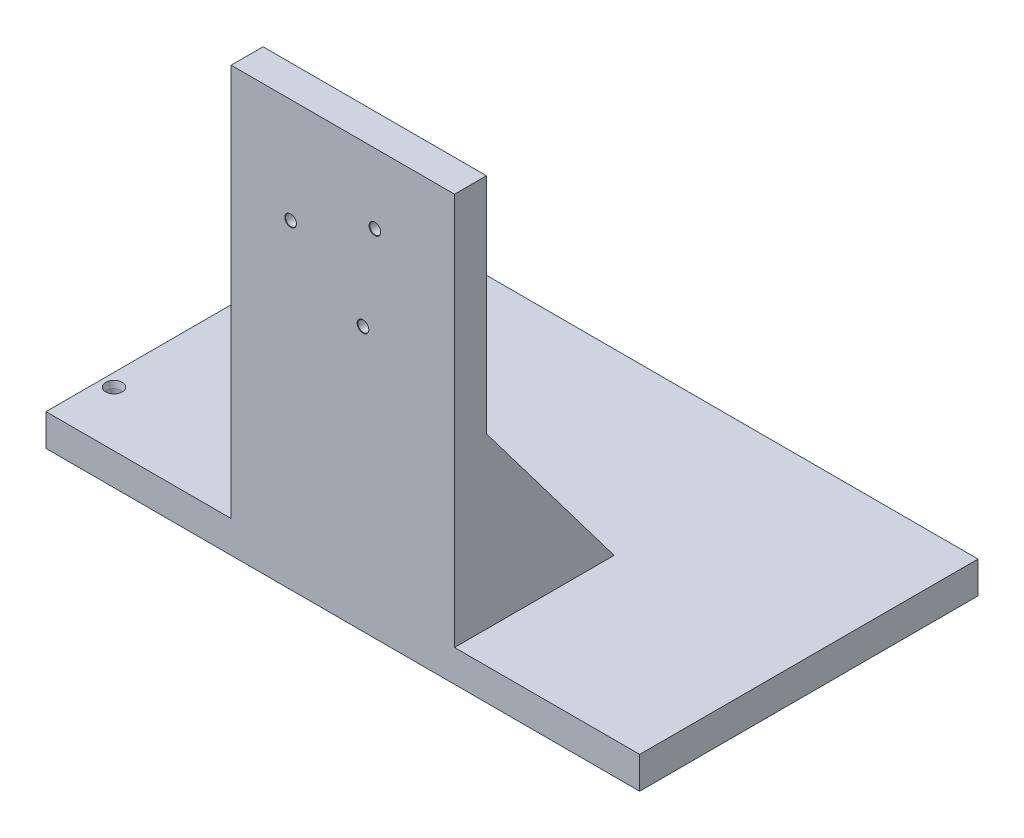
ISO-10303-21;
HEADER;
FILE_DESCRIPTION(('STEP AP214'),'2;1');
FILE_NAME('part.step','',(''),(''),'','','');
FILE_SCHEMA(('AUTOMOTIVE_DESIGN { 1 0 10303 214 1 1 1 1 }'));
ENDSEC;
DATA;
#1=APPLICATION_CONTEXT('core data for automotive mechanical design processes');
#2=APPLICATION_PROTOCOL_DEFINITION('international standard','automotive_design',2000,#1);
#3=PRODUCT_CONTEXT('',#1,'mechanical');
#4=PRODUCT('Part','Part','',(#3));
#5=PRODUCT_RELATED_PRODUCT_CATEGORY('part','',(#4));
#6=PRODUCT_DEFINITION_FORMATION('','',#4);
#7=PRODUCT_DEFINITION_CONTEXT('part definition',#1,'design');
#8=PRODUCT_DEFINITION('design','',#6,#7);
#9=PRODUCT_DEFINITION_SHAPE('','',#8);
#10=(LENGTH_UNIT() NAMED_UNIT(*) SI_UNIT(.MILLI.,.METRE.));
#11=(NAMED_UNIT(*) PLANE_ANGLE_UNIT() SI_UNIT($,.RADIAN.));
#12=(NAMED_UNIT(*) SI_UNIT($,.STERADIAN.) SOLID_ANGLE_UNIT());
#13=UNCERTAINTY_MEASURE_WITH_UNIT(LENGTH_MEASURE(1.E-05),#10,'distance_accuracy_value','');
#14=(GEOMETRIC_REPRESENTATION_CONTEXT(3) GLOBAL_UNCERTAINTY_ASSIGNED_CONTEXT((#13)) GLOBAL_UNIT_ASSIGNED_CONTEXT((#10,
#11,#12)) REPRESENTATION_CONTEXT('',''));
#15=CARTESIAN_POINT('',(0.,0.,0.));
#16=DIRECTION('',(0.,0.,1.));
#17=DIRECTION('',(1.,0.,0.));
#18=AXIS2_PLACEMENT_3D('',#15,#16,#17);
#19=CARTESIAN_POINT('',(35.,-35.,10.));
#20=DIRECTION('',(-1.,0.,0.));
#21=DIRECTION('',(0.,0.,1.));
#22=AXIS2_PLACEMENT_3D('',#19,#20,#21);
#23=PLANE('',#22);
#24=DIRECTION('',(0.,0.,1.));
#25=VECTOR('',#24,1.);
#26=CARTESIAN_POINT('',(35.,-88.,10.));
#27=LINE('',#26,#25);
#28=CARTESIAN_POINT('',(35.,-88.,-39.9999999999999));
#29=VERTEX_POINT('',#28);
#30=CARTESIAN_POINT('',(35.,-88.,10.));
#31=VERTEX_POINT('',#30);
#32=EDGE_CURVE('E64',#29,#31,#27,.T.);
#33=ORIENTED_EDGE('',*,*,#32,.F.);
#34=DIRECTION('',(0.,0.79818915033323,0.602406905911873));
#35=VECTOR('',#34,1.);
#36=CARTESIAN_POINT('',(35.,-30.1916534361534,3.62894080290327));
#37=LINE('',#36,#35);
#38=CARTESIAN_POINT('',(35.,-35.0000000000002,0.));
#39=VERTEX_POINT('',#38);
#40=EDGE_CURVE('E11',#29,#39,#37,.T.);
#41=ORIENTED_EDGE('',*,*,#40,.T.);
#42=DIRECTION('',(0.,1.,0.));
#43=VECTOR('',#42,1.);
#44=CARTESIAN_POINT('',(35.,-35.,0.));
#45=LINE('',#44,#43);
#46=CARTESIAN_POINT('',(35.,35.,0.));
#47=VERTEX_POINT('',#46);
#48=EDGE_CURVE('E186',#39,#47,#45,.T.);
#49=ORIENTED_EDGE('',*,*,#48,.T.);
#50=DIRECTION('',(0.,0.,-1.));
#51=VECTOR('',#50,1.);
#52=CARTESIAN_POINT('',(35.,35.,10.));
#53=LINE('',#52,#51);
#54=CARTESIAN_POINT('',(35.,35.,10.));
#55=VERTEX_POINT('',#54);
#56=EDGE_CURVE('E203',#55,#47,#53,.T.);
#57=ORIENTED_EDGE('',*,*,#56,.F.);
#58=DIRECTION('',(0.,1.,0.));
#59=VECTOR('',#58,1.);
#60=CARTESIAN_POINT('',(35.,-35.,10.));
#61=LINE('',#60,#59);
#62=EDGE_CURVE('E187',#31,#55,#61,.T.);
#63=ORIENTED_EDGE('',*,*,#62,.F.);
#64=EDGE_LOOP('',(#33,#41,#49,#57,#63));
#65=FACE_BOUND('',#64,.T.);
#66=ADVANCED_FACE('F41',(#65),#23,.F.);
#67=CARTESIAN_POINT('',(-35.,-35.,10.));
#68=DIRECTION('',(1.,0.,0.));
#69=DIRECTION('',(0.,0.,-1.));
#70=AXIS2_PLACEMENT_3D('',#67,#68,#69);
#71=PLANE('',#70);
#72=DIRECTION('',(0.,0.,-1.));
#73=VECTOR('',#72,1.);
#74=CARTESIAN_POINT('',(-35.,-88.,10.));
#75=LINE('',#74,#73);
#76=CARTESIAN_POINT('',(-35.,-88.,10.));
#77=VERTEX_POINT('',#76);
#78=CARTESIAN_POINT('',(-35.,-88.,-39.9999999999999));
#79=VERTEX_POINT('',#78);
#80=EDGE_CURVE('E57',#77,#79,#75,.T.);
#81=ORIENTED_EDGE('',*,*,#80,.F.);
#82=DIRECTION('',(0.,-1.,0.));
#83=VECTOR('',#82,1.);
#84=CARTESIAN_POINT('',(-35.,-35.,10.));
#85=LINE('',#84,#83);
#86=CARTESIAN_POINT('',(-35.,35.,10.));
#87=VERTEX_POINT('',#86);
#88=EDGE_CURVE('E192',#87,#77,#85,.T.);
#89=ORIENTED_EDGE('',*,*,#88,.F.);
#90=DIRECTION('',(0.,0.,-1.));
#91=VECTOR('',#90,1.);
#92=CARTESIAN_POINT('',(-35.,35.,10.));
#93=LINE('',#92,#91);
#94=CARTESIAN_POINT('',(-35.,35.,0.));
#95=VERTEX_POINT('',#94);
#96=EDGE_CURVE('E195',#87,#95,#93,.T.);
#97=ORIENTED_EDGE('',*,*,#96,.T.);
#98=DIRECTION('',(0.,-1.,0.));
#99=VECTOR('',#98,1.);
#100=CARTESIAN_POINT('',(-35.,-35.,0.));
#101=LINE('',#100,#99);
#102=CARTESIAN_POINT('',(-35.,-35.0000000000002,0.));
#103=VERTEX_POINT('',#102);
#104=EDGE_CURVE('E190',#95,#103,#101,.T.);
#105=ORIENTED_EDGE('',*,*,#104,.T.);
#106=DIRECTION('',(0.,-0.79818915033323,-0.602406905911873));
#107=VECTOR('',#106,1.);
#108=CARTESIAN_POINT('',(-35.,-30.1916534361534,3.62894080290327));
#109=LINE('',#108,#107);
#110=EDGE_CURVE('E50',#103,#79,#109,.T.);
#111=ORIENTED_EDGE('',*,*,#110,.T.);
#112=EDGE_LOOP('',(#81,#89,#97,#105,#111));
#113=FACE_BOUND('',#112,.T.);
#114=ADVANCED_FACE('F212',(#113),#71,.F.);
#115=CARTESIAN_POINT('',(0.,0.,0.));
#116=DIRECTION('',(0.,0.,-1.));
#117=DIRECTION('',(-1.,0.,0.));
#118=AXIS2_PLACEMENT_3D('',#115,#116,#117);
#119=PLANE('',#118);
#120=CARTESIAN_POINT('',(6.31427663402399,-15.2440122864362,0.));
#121=DIRECTION('',(0.,0.,-1.));
#122=DIRECTION('',(-1.,0.,0.));
#123=AXIS2_PLACEMENT_3D('',#120,#121,#122);
#124=CIRCLE('',#123,1.7);
#125=CARTESIAN_POINT('',(4.61427663402399,-15.2440122864362,0.));
#126=VERTEX_POINT('',#125);
#127=EDGE_CURVE('E165',#126,#126,#124,.T.);
#128=ORIENTED_EDGE('',*,*,#127,.F.);
#129=EDGE_LOOP('',(#128));
#130=FACE_BOUND('',#129,.T.);
#131=CARTESIAN_POINT('',(10.0445635786439,13.0903301148054,0.));
#132=DIRECTION('',(0.,0.,-1.));
#133=DIRECTION('',(-1.,0.,0.));
#134=AXIS2_PLACEMENT_3D('',#131,#132,#133);
#135=CIRCLE('',#134,1.7);
#136=CARTESIAN_POINT('',(8.34456357864391,13.0903301148054,0.));
#137=VERTEX_POINT('',#136);
#138=EDGE_CURVE('E174',#137,#137,#135,.T.);
#139=ORIENTED_EDGE('',*,*,#138,.F.);
#140=EDGE_LOOP('',(#139));
#141=FACE_BOUND('',#140,.T.);
#142=CARTESIAN_POINT('',(-16.3588402126679,2.1536821716308,0.));
#143=DIRECTION('',(0.,0.,-1.));
#144=DIRECTION('',(-1.,0.,0.));
#145=AXIS2_PLACEMENT_3D('',#142,#143,#144);
#146=CIRCLE('',#145,1.7);
#147=CARTESIAN_POINT('',(-18.0588402126679,2.1536821716308,0.));
#148=VERTEX_POINT('',#147);
#149=EDGE_CURVE('E183',#148,#148,#146,.T.);
#150=ORIENTED_EDGE('',*,*,#149,.F.);
#151=EDGE_LOOP('',(#150));
#152=FACE_BOUND('',#151,.T.);
#153=ORIENTED_EDGE('',*,*,#48,.F.);
#154=DIRECTION('',(-1.,0.,0.));
#155=VECTOR('',#154,1.);
#156=CARTESIAN_POINT('',(0.,-35.0000000000002,0.));
#157=LINE('',#156,#155);
#158=EDGE_CURVE('E206',#39,#103,#157,.T.);
#159=ORIENTED_EDGE('',*,*,#158,.T.);
#160=ORIENTED_EDGE('',*,*,#104,.F.);
#161=DIRECTION('',(-1.,0.,0.));
#162=VECTOR('',#161,1.);
#163=CARTESIAN_POINT('',(-35.,35.,0.));
#164=LINE('',#163,#162);
#165=EDGE_CURVE('E197',#47,#95,#164,.T.);
#166=ORIENTED_EDGE('',*,*,#165,.F.);
#167=EDGE_LOOP('',(#153,#159,#160,#166));
#168=FACE_BOUND('',#167,.T.);
#169=ADVANCED_FACE('F232',(#130,#141,#152,#168),#119,.T.);
#170=CARTESIAN_POINT('',(0.,0.,10.));
#171=DIRECTION('',(0.,0.,-1.));
#172=DIRECTION('',(-1.,0.,0.));
#173=AXIS2_PLACEMENT_3D('',#170,#171,#172);
#174=PLANE('',#173);
#175=DIRECTION('',(-1.,0.,0.));
#176=VECTOR('',#175,1.);
#177=CARTESIAN_POINT('',(-35.,-98.,10.));
#178=LINE('',#177,#176);
#179=CARTESIAN_POINT('',(93.,-98.,10.));
#180=VERTEX_POINT('',#179);
#181=CARTESIAN_POINT('',(-93.,-98.,10.));
#182=VERTEX_POINT('',#181);
#183=EDGE_CURVE('E157',#180,#182,#178,.T.);
#184=ORIENTED_EDGE('',*,*,#183,.F.);
#185=DIRECTION('',(0.,-1.,0.));
#186=VECTOR('',#185,1.);
#187=CARTESIAN_POINT('',(93.,-88.,10.));
#188=LINE('',#187,#186);
#189=CARTESIAN_POINT('',(93.,-88.,10.));
#190=VERTEX_POINT('',#189);
#191=EDGE_CURVE('E151',#190,#180,#188,.T.);
#192=ORIENTED_EDGE('',*,*,#191,.F.);
#193=DIRECTION('',(1.,0.,0.));
#194=VECTOR('',#193,1.);
#195=CARTESIAN_POINT('',(-93.,-88.,10.));
#196=LINE('',#195,#194);
#197=EDGE_CURVE('E145',#31,#190,#196,.T.);
#198=ORIENTED_EDGE('',*,*,#197,.F.);
#199=ORIENTED_EDGE('',*,*,#62,.T.);
#200=DIRECTION('',(-1.,0.,0.));
#201=VECTOR('',#200,1.);
#202=CARTESIAN_POINT('',(-35.,35.,10.));
#203=LINE('',#202,#201);
#204=EDGE_CURVE('E189',#55,#87,#203,.T.);
#205=ORIENTED_EDGE('',*,*,#204,.T.);
#206=ORIENTED_EDGE('',*,*,#88,.T.);
#207=CARTESIAN_POINT('',(-93.,-88.,10.));
#208=VERTEX_POINT('',#207);
#209=EDGE_CURVE('E123',#208,#77,#196,.T.);
#210=ORIENTED_EDGE('',*,*,#209,.F.);
#211=DIRECTION('',(0.,-1.,0.));
#212=VECTOR('',#211,1.);
#213=CARTESIAN_POINT('',(-93.,-88.,10.));
#214=LINE('',#213,#212);
#215=EDGE_CURVE('E134',#208,#182,#214,.T.);
#216=ORIENTED_EDGE('',*,*,#215,.T.);
#217=EDGE_LOOP('',(#184,#192,#198,#199,#205,#206,#210,#216));
#218=FACE_BOUND('',#217,.T.);
#219=CARTESIAN_POINT('',(6.31427663402399,-15.2440122864362,10.));
#220=DIRECTION('',(0.,0.,1.));
#221=DIRECTION('',(1.,0.,0.));
#222=AXIS2_PLACEMENT_3D('',#219,#220,#221);
#223=CIRCLE('',#222,1.825);
#224=CARTESIAN_POINT('',(8.13927663402399,-15.2440122864362,10.));
#225=VERTEX_POINT('',#224);
#226=EDGE_CURVE('E159',#225,#225,#223,.T.);
#227=ORIENTED_EDGE('',*,*,#226,.F.);
#228=EDGE_LOOP('',(#227));
#229=FACE_BOUND('',#228,.T.);
#230=CARTESIAN_POINT('',(10.0445635786439,13.0903301148054,10.));
#231=DIRECTION('',(0.,0.,1.));
#232=DIRECTION('',(1.,0.,0.));
#233=AXIS2_PLACEMENT_3D('',#230,#231,#232);
#234=CIRCLE('',#233,1.825);
#235=CARTESIAN_POINT('',(11.8695635786439,13.0903301148054,10.));
#236=VERTEX_POINT('',#235);
#237=EDGE_CURVE('E168',#236,#236,#234,.T.);
#238=ORIENTED_EDGE('',*,*,#237,.F.);
#239=EDGE_LOOP('',(#238));
#240=FACE_BOUND('',#239,.T.);
#241=CARTESIAN_POINT('',(-16.3588402126679,2.1536821716308,10.));
#242=DIRECTION('',(0.,0.,1.));
#243=DIRECTION('',(1.,0.,0.));
#244=AXIS2_PLACEMENT_3D('',#241,#242,#243);
#245=CIRCLE('',#244,1.825);
#246=CARTESIAN_POINT('',(-14.5338402126679,2.1536821716308,10.));
#247=VERTEX_POINT('',#246);
#248=EDGE_CURVE('E177',#247,#247,#245,.T.);
#249=ORIENTED_EDGE('',*,*,#248,.F.);
#250=EDGE_LOOP('',(#249));
#251=FACE_BOUND('',#250,.T.);
#252=ADVANCED_FACE('F222',(#218,#229,#240,#251),#174,.F.);
#253=CARTESIAN_POINT('',(-35.,35.,10.));
#254=DIRECTION('',(0.,-1.,0.));
#255=DIRECTION('',(0.,0.,-1.));
#256=AXIS2_PLACEMENT_3D('',#253,#254,#255);
#257=PLANE('',#256);
#258=ORIENTED_EDGE('',*,*,#165,.T.);
#259=ORIENTED_EDGE('',*,*,#96,.F.);
#260=ORIENTED_EDGE('',*,*,#204,.F.);
#261=ORIENTED_EDGE('',*,*,#56,.T.);
#262=EDGE_LOOP('',(#258,#259,#260,#261));
#263=FACE_BOUND('',#262,.T.);
#264=ADVANCED_FACE('F229',(#263),#257,.F.);
#265=CARTESIAN_POINT('',(-16.3588402126679,2.1536821716308,10.));
#266=DIRECTION('',(0.,0.,1.));
#267=DIRECTION('',(1.,0.,0.));
#268=AXIS2_PLACEMENT_3D('',#265,#266,#267);
#269=CYLINDRICAL_SURFACE('',#268,1.7);
#270=CARTESIAN_POINT('',(-16.3588402126679,2.1536821716308,9.875));
#271=DIRECTION('',(0.,0.,1.));
#272=DIRECTION('',(1.,0.,0.));
#273=AXIS2_PLACEMENT_3D('',#270,#271,#272);
#274=CIRCLE('',#273,1.7);
#275=CARTESIAN_POINT('',(-14.6588402126679,2.1536821716308,9.875));
#276=VERTEX_POINT('',#275);
#277=EDGE_CURVE('E180',#276,#276,#274,.T.);
#278=ORIENTED_EDGE('',*,*,#277,.T.);
#279=EDGE_LOOP('',(#278));
#280=FACE_BOUND('',#279,.T.);
#281=ORIENTED_EDGE('',*,*,#149,.T.);
#282=EDGE_LOOP('',(#281));
#283=FACE_BOUND('',#282,.T.);
#284=ADVANCED_FACE('F361',(#280,#283),#269,.F.);
#285=CARTESIAN_POINT('',(-16.3588402126679,2.1536821716308,10.));
#286=DIRECTION('',(0.,0.,1.));
#287=DIRECTION('',(1.,0.,0.));
#288=AXIS2_PLACEMENT_3D('',#285,#286,#287);
#289=CONICAL_SURFACE('',#288,1.825,0.785398163397448);
#290=ORIENTED_EDGE('',*,*,#277,.F.);
#291=EDGE_LOOP('',(#290));
#292=FACE_BOUND('',#291,.T.);
#293=ORIENTED_EDGE('',*,*,#248,.T.);
#294=EDGE_LOOP('',(#293));
#295=FACE_BOUND('',#294,.T.);
#296=ADVANCED_FACE('F357',(#292,#295),#289,.F.);
#297=CARTESIAN_POINT('',(10.0445635786439,13.0903301148054,10.));
#298=DIRECTION('',(0.,0.,1.));
#299=DIRECTION('',(1.,0.,0.));
#300=AXIS2_PLACEMENT_3D('',#297,#298,#299);
#301=CYLINDRICAL_SURFACE('',#300,1.7);
#302=CARTESIAN_POINT('',(10.0445635786439,13.0903301148054,9.875));
#303=DIRECTION('',(0.,0.,1.));
#304=DIRECTION('',(1.,0.,0.));
#305=AXIS2_PLACEMENT_3D('',#302,#303,#304);
#306=CIRCLE('',#305,1.7);
#307=CARTESIAN_POINT('',(11.7445635786439,13.0903301148054,9.875));
#308=VERTEX_POINT('',#307);
#309=EDGE_CURVE('E171',#308,#308,#306,.T.);
#310=ORIENTED_EDGE('',*,*,#309,.T.);
#311=EDGE_LOOP('',(#310));
#312=FACE_BOUND('',#311,.T.);
#313=ORIENTED_EDGE('',*,*,#138,.T.);
#314=EDGE_LOOP('',(#313));
#315=FACE_BOUND('',#314,.T.);
#316=ADVANCED_FACE('F353',(#312,#315),#301,.F.);
#317=CARTESIAN_POINT('',(10.0445635786439,13.0903301148054,10.));
#318=DIRECTION('',(0.,0.,1.));
#319=DIRECTION('',(1.,0.,0.));
#320=AXIS2_PLACEMENT_3D('',#317,#318,#319);
#321=CONICAL_SURFACE('',#320,1.825,0.785398163397448);
#322=ORIENTED_EDGE('',*,*,#309,.F.);
#323=EDGE_LOOP('',(#322));
#324=FACE_BOUND('',#323,.T.);
#325=ORIENTED_EDGE('',*,*,#237,.T.);
#326=EDGE_LOOP('',(#325));
#327=FACE_BOUND('',#326,.T.);
#328=ADVANCED_FACE('F349',(#324,#327),#321,.F.);
#329=CARTESIAN_POINT('',(6.31427663402399,-15.2440122864362,10.));
#330=DIRECTION('',(0.,0.,1.));
#331=DIRECTION('',(1.,0.,0.));
#332=AXIS2_PLACEMENT_3D('',#329,#330,#331);
#333=CYLINDRICAL_SURFACE('',#332,1.7);
#334=CARTESIAN_POINT('',(6.31427663402399,-15.2440122864362,9.875));
#335=DIRECTION('',(0.,0.,1.));
#336=DIRECTION('',(1.,0.,0.));
#337=AXIS2_PLACEMENT_3D('',#334,#335,#336);
#338=CIRCLE('',#337,1.7);
#339=CARTESIAN_POINT('',(8.01427663402399,-15.2440122864362,9.875));
#340=VERTEX_POINT('',#339);
#341=EDGE_CURVE('E162',#340,#340,#338,.T.);
#342=ORIENTED_EDGE('',*,*,#341,.T.);
#343=EDGE_LOOP('',(#342));
#344=FACE_BOUND('',#343,.T.);
#345=ORIENTED_EDGE('',*,*,#127,.T.);
#346=EDGE_LOOP('',(#345));
#347=FACE_BOUND('',#346,.T.);
#348=ADVANCED_FACE('F345',(#344,#347),#333,.F.);
#349=CARTESIAN_POINT('',(6.31427663402399,-15.2440122864362,10.));
#350=DIRECTION('',(0.,0.,1.));
#351=DIRECTION('',(1.,0.,0.));
#352=AXIS2_PLACEMENT_3D('',#349,#350,#351);
#353=CONICAL_SURFACE('',#352,1.825,0.785398163397448);
#354=ORIENTED_EDGE('',*,*,#341,.F.);
#355=EDGE_LOOP('',(#354));
#356=FACE_BOUND('',#355,.T.);
#357=ORIENTED_EDGE('',*,*,#226,.T.);
#358=EDGE_LOOP('',(#357));
#359=FACE_BOUND('',#358,.T.);
#360=ADVANCED_FACE('F341',(#356,#359),#353,.F.);
#361=CARTESIAN_POINT('',(0.,-98.,0.));
#362=DIRECTION('',(0.,-1.,0.));
#363=DIRECTION('',(0.,0.,-1.));
#364=AXIS2_PLACEMENT_3D('',#361,#362,#363);
#365=PLANE('',#364);
#366=DIRECTION('',(0.,0.,-1.));
#367=VECTOR('',#366,1.);
#368=CARTESIAN_POINT('',(93.,-98.,10.));
#369=LINE('',#368,#367);
#370=CARTESIAN_POINT('',(93.,-98.,-96.));
#371=VERTEX_POINT('',#370);
#372=EDGE_CURVE('E136',#180,#371,#369,.T.);
#373=ORIENTED_EDGE('',*,*,#372,.F.);
#374=ORIENTED_EDGE('',*,*,#183,.T.);
#375=DIRECTION('',(0.,0.,-1.));
#376=VECTOR('',#375,1.);
#377=CARTESIAN_POINT('',(-93.,-98.,10.));
#378=LINE('',#377,#376);
#379=CARTESIAN_POINT('',(-93.,-98.,-96.));
#380=VERTEX_POINT('',#379);
#381=EDGE_CURVE('E147',#182,#380,#378,.T.);
#382=ORIENTED_EDGE('',*,*,#381,.T.);
#383=DIRECTION('',(1.,0.,0.));
#384=VECTOR('',#383,1.);
#385=CARTESIAN_POINT('',(-93.,-98.,-96.));
#386=LINE('',#385,#384);
#387=EDGE_CURVE('E117',#380,#371,#386,.T.);
#388=ORIENTED_EDGE('',*,*,#387,.T.);
#389=EDGE_LOOP('',(#373,#374,#382,#388));
#390=FACE_BOUND('',#389,.T.);
#391=ADVANCED_FACE('F330',(#390),#365,.T.);
#392=CARTESIAN_POINT('',(0.,-88.,0.));
#393=DIRECTION('',(0.,-1.,0.));
#394=DIRECTION('',(0.,0.,-1.));
#395=AXIS2_PLACEMENT_3D('',#392,#393,#394);
#396=PLANE('',#395);
#397=CARTESIAN_POINT('',(-89.,-88.,-7.3));
#398=DIRECTION('',(0.,1.,0.));
#399=DIRECTION('',(0.,0.,1.));
#400=AXIS2_PLACEMENT_3D('',#397,#398,#399);
#401=CIRCLE('',#400,2.60000000000002);
#402=CARTESIAN_POINT('',(-89.,-88.,-4.69999999999998));
#403=VERTEX_POINT('',#402);
#404=EDGE_CURVE('E599',#403,#403,#401,.T.);
#405=ORIENTED_EDGE('',*,*,#404,.F.);
#406=EDGE_LOOP('',(#405));
#407=FACE_BOUND('',#406,.T.);
#408=CARTESIAN_POINT('',(-89.,-88.,-82.2));
#409=DIRECTION('',(0.,1.,0.));
#410=DIRECTION('',(0.,0.,1.));
#411=AXIS2_PLACEMENT_3D('',#408,#409,#410);
#412=CIRCLE('',#411,2.60000000000002);
#413=CARTESIAN_POINT('',(-89.,-88.,-79.6));
#414=VERTEX_POINT('',#413);
#415=EDGE_CURVE('E601',#414,#414,#412,.T.);
#416=ORIENTED_EDGE('',*,*,#415,.F.);
#417=EDGE_LOOP('',(#416));
#418=FACE_BOUND('',#417,.T.);
#419=CARTESIAN_POINT('',(-40.8,-88.,-6.));
#420=DIRECTION('',(0.,1.,0.));
#421=DIRECTION('',(0.,0.,1.));
#422=AXIS2_PLACEMENT_3D('',#419,#420,#421);
#423=CIRCLE('',#422,2.60000000000001);
#424=CARTESIAN_POINT('',(-40.8,-88.,-3.39999999999999));
#425=VERTEX_POINT('',#424);
#426=EDGE_CURVE('E614',#425,#425,#423,.T.);
#427=ORIENTED_EDGE('',*,*,#426,.F.);
#428=EDGE_LOOP('',(#427));
#429=FACE_BOUND('',#428,.T.);
#430=CARTESIAN_POINT('',(-73.8,-88.,-58.1));
#431=DIRECTION('',(0.,1.,0.));
#432=DIRECTION('',(0.,0.,1.));
#433=AXIS2_PLACEMENT_3D('',#430,#431,#432);
#434=CIRCLE('',#433,2.60000000000002);
#435=CARTESIAN_POINT('',(-73.8,-88.,-55.5));
#436=VERTEX_POINT('',#435);
#437=EDGE_CURVE('E291',#436,#436,#434,.T.);
#438=ORIENTED_EDGE('',*,*,#437,.F.);
#439=EDGE_LOOP('',(#438));
#440=FACE_BOUND('',#439,.T.);
#441=CARTESIAN_POINT('',(-45.9,-88.,-58.1));
#442=DIRECTION('',(0.,1.,0.));
#443=DIRECTION('',(0.,0.,1.));
#444=AXIS2_PLACEMENT_3D('',#441,#442,#443);
#445=CIRCLE('',#444,2.60000000000001);
#446=CARTESIAN_POINT('',(-45.9,-88.,-55.5));
#447=VERTEX_POINT('',#446);
#448=EDGE_CURVE('E299',#447,#447,#445,.T.);
#449=ORIENTED_EDGE('',*,*,#448,.F.);
#450=EDGE_LOOP('',(#449));
#451=FACE_BOUND('',#450,.T.);
#452=ORIENTED_EDGE('',*,*,#80,.T.);
#453=DIRECTION('',(1.,0.,0.));
#454=VECTOR('',#453,1.);
#455=CARTESIAN_POINT('',(0.,-88.,-39.9999999999999));
#456=LINE('',#455,#454);
#457=EDGE_CURVE('E209',#79,#29,#456,.T.);
#458=ORIENTED_EDGE('',*,*,#457,.T.);
#459=ORIENTED_EDGE('',*,*,#32,.T.);
#460=ORIENTED_EDGE('',*,*,#197,.T.);
#461=DIRECTION('',(0.,0.,-1.));
#462=VECTOR('',#461,1.);
#463=CARTESIAN_POINT('',(93.,-88.,10.));
#464=LINE('',#463,#462);
#465=CARTESIAN_POINT('',(93.,-88.,-96.));
#466=VERTEX_POINT('',#465);
#467=EDGE_CURVE('E129',#190,#466,#464,.T.);
#468=ORIENTED_EDGE('',*,*,#467,.T.);
#469=DIRECTION('',(1.,0.,0.));
#470=VECTOR('',#469,1.);
#471=CARTESIAN_POINT('',(-93.,-88.,-96.));
#472=LINE('',#471,#470);
#473=CARTESIAN_POINT('',(-93.,-88.,-96.));
#474=VERTEX_POINT('',#473);
#475=EDGE_CURVE('E115',#474,#466,#472,.T.);
#476=ORIENTED_EDGE('',*,*,#475,.F.);
#477=DIRECTION('',(0.,0.,-1.));
#478=VECTOR('',#477,1.);
#479=CARTESIAN_POINT('',(-93.,-88.,10.));
#480=LINE('',#479,#478);
#481=EDGE_CURVE('E127',#208,#474,#480,.T.);
#482=ORIENTED_EDGE('',*,*,#481,.F.);
#483=ORIENTED_EDGE('',*,*,#209,.T.);
#484=EDGE_LOOP('',(#452,#458,#459,#460,#468,#476,#482,#483));
#485=FACE_BOUND('',#484,.T.);
#486=ADVANCED_FACE('F126',(#407,#418,#429,#440,#451,#485),#396,.F.);
#487=CARTESIAN_POINT('',(-93.,-88.,10.));
#488=DIRECTION('',(-1.,0.,0.));
#489=DIRECTION('',(0.,0.,1.));
#490=AXIS2_PLACEMENT_3D('',#487,#488,#489);
#491=PLANE('',#490);
#492=ORIENTED_EDGE('',*,*,#381,.F.);
#493=ORIENTED_EDGE('',*,*,#215,.F.);
#494=ORIENTED_EDGE('',*,*,#481,.T.);
#495=DIRECTION('',(0.,-1.,0.));
#496=VECTOR('',#495,1.);
#497=CARTESIAN_POINT('',(-93.,-88.,-96.));
#498=LINE('',#497,#496);
#499=EDGE_CURVE('E112',#474,#380,#498,.T.);
#500=ORIENTED_EDGE('',*,*,#499,.T.);
#501=EDGE_LOOP('',(#492,#493,#494,#500));
#502=FACE_BOUND('',#501,.T.);
#503=ADVANCED_FACE('F132',(#502),#491,.T.);
#504=CARTESIAN_POINT('',(93.,-88.,10.));
#505=DIRECTION('',(-1.,0.,0.));
#506=DIRECTION('',(0.,0.,1.));
#507=AXIS2_PLACEMENT_3D('',#504,#505,#506);
#508=PLANE('',#507);
#509=ORIENTED_EDGE('',*,*,#372,.T.);
#510=DIRECTION('',(0.,-1.,0.));
#511=VECTOR('',#510,1.);
#512=CARTESIAN_POINT('',(93.,-88.,-96.));
#513=LINE('',#512,#511);
#514=EDGE_CURVE('E122',#466,#371,#513,.T.);
#515=ORIENTED_EDGE('',*,*,#514,.F.);
#516=ORIENTED_EDGE('',*,*,#467,.F.);
#517=ORIENTED_EDGE('',*,*,#191,.T.);
#518=EDGE_LOOP('',(#509,#515,#516,#517));
#519=FACE_BOUND('',#518,.T.);
#520=ADVANCED_FACE('F332',(#519),#508,.F.);
#521=CARTESIAN_POINT('',(-93.,-88.,-96.));
#522=DIRECTION('',(0.,0.,-1.));
#523=DIRECTION('',(-1.,0.,0.));
#524=AXIS2_PLACEMENT_3D('',#521,#522,#523);
#525=PLANE('',#524);
#526=ORIENTED_EDGE('',*,*,#387,.F.);
#527=ORIENTED_EDGE('',*,*,#499,.F.);
#528=ORIENTED_EDGE('',*,*,#475,.T.);
#529=ORIENTED_EDGE('',*,*,#514,.T.);
#530=EDGE_LOOP('',(#526,#527,#528,#529));
#531=FACE_BOUND('',#530,.T.);
#532=ADVANCED_FACE('F114',(#531),#525,.T.);
#533=CARTESIAN_POINT('',(0.,-35.0000000000002,0.));
#534=DIRECTION('',(0.,-0.602406905911873,0.79818915033323));
#535=DIRECTION('',(-1.,0.,0.));
#536=AXIS2_PLACEMENT_3D('',#533,#534,#535);
#537=PLANE('',#536);
#538=ORIENTED_EDGE('',*,*,#40,.F.);
#539=ORIENTED_EDGE('',*,*,#457,.F.);
#540=ORIENTED_EDGE('',*,*,#110,.F.);
#541=ORIENTED_EDGE('',*,*,#158,.F.);
#542=EDGE_LOOP('',(#538,#539,#540,#541));
#543=FACE_BOUND('',#542,.T.);
#544=ADVANCED_FACE('F218',(#543),#537,.F.);
#545=CARTESIAN_POINT('',(-45.9,-97.,-58.1));
#546=DIRECTION('',(0.,-1.,0.));
#547=DIRECTION('',(0.,0.,-1.));
#548=AXIS2_PLACEMENT_3D('',#545,#546,#547);
#549=PLANE('',#548);
#550=CARTESIAN_POINT('',(-45.9,-97.,-58.1));
#551=DIRECTION('',(0.,1.,0.));
#552=DIRECTION('',(0.,0.,1.));
#553=AXIS2_PLACEMENT_3D('',#550,#551,#552);
#554=CIRCLE('',#553,2.25000000000002);
#555=CARTESIAN_POINT('',(-45.9,-97.,-55.85));
#556=VERTEX_POINT('',#555);
#557=EDGE_CURVE('E141',#556,#556,#554,.T.);
#558=ORIENTED_EDGE('',*,*,#557,.T.);
#559=EDGE_LOOP('',(#558));
#560=FACE_BOUND('',#559,.T.);
#561=ADVANCED_FACE('F257',(#560),#549,.F.);
#562=CARTESIAN_POINT('',(-45.9,-88.,-58.1));
#563=DIRECTION('',(0.,1.,0.));
#564=DIRECTION('',(0.,0.,1.));
#565=AXIS2_PLACEMENT_3D('',#562,#563,#564);
#566=CYLINDRICAL_SURFACE('',#565,2.25000000000002);
#567=ORIENTED_EDGE('',*,*,#557,.F.);
#568=EDGE_LOOP('',(#567));
#569=FACE_BOUND('',#568,.T.);
#570=CARTESIAN_POINT('',(-45.9,-90.,-58.1));
#571=DIRECTION('',(0.,1.,0.));
#572=DIRECTION('',(0.,0.,1.));
#573=AXIS2_PLACEMENT_3D('',#570,#571,#572);
#574=CIRCLE('',#573,2.25000000000002);
#575=CARTESIAN_POINT('',(-45.9,-90.,-55.85));
#576=VERTEX_POINT('',#575);
#577=EDGE_CURVE('E306',#576,#576,#574,.T.);
#578=ORIENTED_EDGE('',*,*,#577,.T.);
#579=EDGE_LOOP('',(#578));
#580=FACE_BOUND('',#579,.T.);
#581=ADVANCED_FACE('F314',(#569,#580),#566,.F.);
#582=CARTESIAN_POINT('',(-73.8,-97.,-58.1));
#583=DIRECTION('',(0.,-1.,0.));
#584=DIRECTION('',(0.,0.,-1.));
#585=AXIS2_PLACEMENT_3D('',#582,#583,#584);
#586=PLANE('',#585);
#587=CARTESIAN_POINT('',(-73.8,-97.,-58.1));
#588=DIRECTION('',(0.,1.,0.));
#589=DIRECTION('',(0.,0.,1.));
#590=AXIS2_PLACEMENT_3D('',#587,#588,#589);
#591=CIRCLE('',#590,2.25000000000002);
#592=CARTESIAN_POINT('',(-73.8,-97.,-55.85));
#593=VERTEX_POINT('',#592);
#594=EDGE_CURVE('E296',#593,#593,#591,.T.);
#595=ORIENTED_EDGE('',*,*,#594,.T.);
#596=EDGE_LOOP('',(#595));
#597=FACE_BOUND('',#596,.T.);
#598=ADVANCED_FACE('F316',(#597),#586,.F.);
#599=CARTESIAN_POINT('',(-73.8,-88.,-58.1));
#600=DIRECTION('',(0.,1.,0.));
#601=DIRECTION('',(0.,0.,1.));
#602=AXIS2_PLACEMENT_3D('',#599,#600,#601);
#603=CYLINDRICAL_SURFACE('',#602,2.25000000000002);
#604=ORIENTED_EDGE('',*,*,#594,.F.);
#605=EDGE_LOOP('',(#604));
#606=FACE_BOUND('',#605,.T.);
#607=CARTESIAN_POINT('',(-73.8,-90.,-58.1));
#608=DIRECTION('',(0.,1.,0.));
#609=DIRECTION('',(0.,0.,1.));
#610=AXIS2_PLACEMENT_3D('',#607,#608,#609);
#611=CIRCLE('',#610,2.25000000000002);
#612=CARTESIAN_POINT('',(-73.8,-90.,-55.85));
#613=VERTEX_POINT('',#612);
#614=EDGE_CURVE('E294',#613,#613,#611,.T.);
#615=ORIENTED_EDGE('',*,*,#614,.T.);
#616=EDGE_LOOP('',(#615));
#617=FACE_BOUND('',#616,.T.);
#618=ADVANCED_FACE('F322',(#606,#617),#603,.F.);
#619=CARTESIAN_POINT('',(-40.8,-97.,-6.));
#620=DIRECTION('',(0.,-1.,0.));
#621=DIRECTION('',(0.,0.,-1.));
#622=AXIS2_PLACEMENT_3D('',#619,#620,#621);
#623=PLANE('',#622);
#624=CARTESIAN_POINT('',(-40.8,-97.,-6.));
#625=DIRECTION('',(0.,1.,0.));
#626=DIRECTION('',(0.,0.,1.));
#627=AXIS2_PLACEMENT_3D('',#624,#625,#626);
#628=CIRCLE('',#627,2.25000000000002);
#629=CARTESIAN_POINT('',(-40.8,-97.,-3.74999999999998));
#630=VERTEX_POINT('',#629);
#631=EDGE_CURVE('E301',#630,#630,#628,.T.);
#632=ORIENTED_EDGE('',*,*,#631,.T.);
#633=EDGE_LOOP('',(#632));
#634=FACE_BOUND('',#633,.T.);
#635=ADVANCED_FACE('F500',(#634),#623,.F.);
#636=CARTESIAN_POINT('',(-40.8,-88.,-6.));
#637=DIRECTION('',(0.,1.,0.));
#638=DIRECTION('',(0.,0.,1.));
#639=AXIS2_PLACEMENT_3D('',#636,#637,#638);
#640=CYLINDRICAL_SURFACE('',#639,2.25000000000002);
#641=ORIENTED_EDGE('',*,*,#631,.F.);
#642=EDGE_LOOP('',(#641));
#643=FACE_BOUND('',#642,.T.);
#644=CARTESIAN_POINT('',(-40.8,-90.,-6.));
#645=DIRECTION('',(0.,1.,0.));
#646=DIRECTION('',(0.,0.,1.));
#647=AXIS2_PLACEMENT_3D('',#644,#645,#646);
#648=CIRCLE('',#647,2.25000000000002);
#649=CARTESIAN_POINT('',(-40.8,-90.,-3.74999999999998));
#650=VERTEX_POINT('',#649);
#651=EDGE_CURVE('E617',#650,#650,#648,.T.);
#652=ORIENTED_EDGE('',*,*,#651,.T.);
#653=EDGE_LOOP('',(#652));
#654=FACE_BOUND('',#653,.T.);
#655=ADVANCED_FACE('F508',(#643,#654),#640,.F.);
#656=CARTESIAN_POINT('',(-89.,-97.,-82.2));
#657=DIRECTION('',(0.,-1.,0.));
#658=DIRECTION('',(0.,0.,-1.));
#659=AXIS2_PLACEMENT_3D('',#656,#657,#658);
#660=PLANE('',#659);
#661=CARTESIAN_POINT('',(-89.,-97.,-82.2));
#662=DIRECTION('',(0.,1.,0.));
#663=DIRECTION('',(0.,0.,1.));
#664=AXIS2_PLACEMENT_3D('',#661,#662,#663);
#665=CIRCLE('',#664,2.25000000000002);
#666=CARTESIAN_POINT('',(-89.,-97.,-79.95));
#667=VERTEX_POINT('',#666);
#668=EDGE_CURVE('E611',#667,#667,#665,.T.);
#669=ORIENTED_EDGE('',*,*,#668,.T.);
#670=EDGE_LOOP('',(#669));
#671=FACE_BOUND('',#670,.T.);
#672=ADVANCED_FACE('F517',(#671),#660,.F.);
#673=CARTESIAN_POINT('',(-89.,-88.,-82.2));
#674=DIRECTION('',(0.,1.,0.));
#675=DIRECTION('',(0.,0.,1.));
#676=AXIS2_PLACEMENT_3D('',#673,#674,#675);
#677=CYLINDRICAL_SURFACE('',#676,2.25000000000002);
#678=ORIENTED_EDGE('',*,*,#668,.F.);
#679=EDGE_LOOP('',(#678));
#680=FACE_BOUND('',#679,.T.);
#681=CARTESIAN_POINT('',(-89.,-90.,-82.2));
#682=DIRECTION('',(0.,1.,0.));
#683=DIRECTION('',(0.,0.,1.));
#684=AXIS2_PLACEMENT_3D('',#681,#682,#683);
#685=CIRCLE('',#684,2.25000000000002);
#686=CARTESIAN_POINT('',(-89.,-90.,-79.95));
#687=VERTEX_POINT('',#686);
#688=EDGE_CURVE('E608',#687,#687,#685,.T.);
#689=ORIENTED_EDGE('',*,*,#688,.T.);
#690=EDGE_LOOP('',(#689));
#691=FACE_BOUND('',#690,.T.);
#692=ADVANCED_FACE('F526',(#680,#691),#677,.F.);
#693=CARTESIAN_POINT('',(-89.,-97.,-7.3));
#694=DIRECTION('',(0.,-1.,0.));
#695=DIRECTION('',(0.,0.,-1.));
#696=AXIS2_PLACEMENT_3D('',#693,#694,#695);
#697=PLANE('',#696);
#698=CARTESIAN_POINT('',(-89.,-97.,-7.3));
#699=DIRECTION('',(0.,1.,0.));
#700=DIRECTION('',(0.,0.,1.));
#701=AXIS2_PLACEMENT_3D('',#698,#699,#700);
#702=CIRCLE('',#701,2.25000000000002);
#703=CARTESIAN_POINT('',(-89.,-97.,-5.04999999999998));
#704=VERTEX_POINT('',#703);
#705=EDGE_CURVE('E594',#704,#704,#702,.T.);
#706=ORIENTED_EDGE('',*,*,#705,.T.);
#707=EDGE_LOOP('',(#706));
#708=FACE_BOUND('',#707,.T.);
#709=ADVANCED_FACE('F535',(#708),#697,.F.);
#710=CARTESIAN_POINT('',(-89.,-88.,-7.3));
#711=DIRECTION('',(0.,1.,0.));
#712=DIRECTION('',(0.,0.,1.));
#713=AXIS2_PLACEMENT_3D('',#710,#711,#712);
#714=CYLINDRICAL_SURFACE('',#713,2.25000000000002);
#715=ORIENTED_EDGE('',*,*,#705,.F.);
#716=EDGE_LOOP('',(#715));
#717=FACE_BOUND('',#716,.T.);
#718=CARTESIAN_POINT('',(-89.,-90.,-7.3));
#719=DIRECTION('',(0.,1.,0.));
#720=DIRECTION('',(0.,0.,1.));
#721=AXIS2_PLACEMENT_3D('',#718,#719,#720);
#722=CIRCLE('',#721,2.25000000000002);
#723=CARTESIAN_POINT('',(-89.,-90.,-5.04999999999998));
#724=VERTEX_POINT('',#723);
#725=EDGE_CURVE('E597',#724,#724,#722,.T.);
#726=ORIENTED_EDGE('',*,*,#725,.T.);
#727=EDGE_LOOP('',(#726));
#728=FACE_BOUND('',#727,.T.);
#729=ADVANCED_FACE('F265',(#717,#728),#714,.F.);
#730=CARTESIAN_POINT('',(-89.,-90.,-82.2));
#731=DIRECTION('',(0.,1.,0.));
#732=DIRECTION('',(0.,0.,1.));
#733=AXIS2_PLACEMENT_3D('',#730,#731,#732);
#734=CONICAL_SURFACE('',#733,2.24999999999986,0.173245666452377);
#735=ORIENTED_EDGE('',*,*,#415,.T.);
#736=EDGE_LOOP('',(#735));
#737=FACE_BOUND('',#736,.T.);
#738=ORIENTED_EDGE('',*,*,#688,.F.);
#739=EDGE_LOOP('',(#738));
#740=FACE_BOUND('',#739,.T.);
#741=ADVANCED_FACE('F258',(#737,#740),#734,.F.);
#742=CARTESIAN_POINT('',(-40.8,-90.,-6.));
#743=DIRECTION('',(0.,1.,0.));
#744=DIRECTION('',(0.,0.,1.));
#745=AXIS2_PLACEMENT_3D('',#742,#743,#744);
#746=CONICAL_SURFACE('',#745,2.25000000000005,0.173245666452367);
#747=ORIENTED_EDGE('',*,*,#426,.T.);
#748=EDGE_LOOP('',(#747));
#749=FACE_BOUND('',#748,.T.);
#750=ORIENTED_EDGE('',*,*,#651,.F.);
#751=EDGE_LOOP('',(#750));
#752=FACE_BOUND('',#751,.T.);
#753=ADVANCED_FACE('F264',(#749,#752),#746,.F.);
#754=CARTESIAN_POINT('',(-89.,-90.,-7.3));
#755=DIRECTION('',(0.,1.,0.));
#756=DIRECTION('',(0.,0.,1.));
#757=AXIS2_PLACEMENT_3D('',#754,#755,#756);
#758=CONICAL_SURFACE('',#757,2.25000000000005,0.173245666452366);
#759=ORIENTED_EDGE('',*,*,#404,.T.);
#760=EDGE_LOOP('',(#759));
#761=FACE_BOUND('',#760,.T.);
#762=ORIENTED_EDGE('',*,*,#725,.F.);
#763=EDGE_LOOP('',(#762));
#764=FACE_BOUND('',#763,.T.);
#765=ADVANCED_FACE('F272',(#761,#764),#758,.F.);
#766=CARTESIAN_POINT('',(-73.8,-90.,-58.1));
#767=DIRECTION('',(0.,1.,0.));
#768=DIRECTION('',(0.,0.,1.));
#769=AXIS2_PLACEMENT_3D('',#766,#767,#768);
#770=CONICAL_SURFACE('',#769,2.25000000000015,0.17324566645237);
#771=ORIENTED_EDGE('',*,*,#437,.T.);
#772=EDGE_LOOP('',(#771));
#773=FACE_BOUND('',#772,.T.);
#774=ORIENTED_EDGE('',*,*,#614,.F.);
#775=EDGE_LOOP('',(#774));
#776=FACE_BOUND('',#775,.T.);
#777=ADVANCED_FACE('F278',(#773,#776),#770,.F.);
#778=CARTESIAN_POINT('',(-45.9,-90.,-58.1));
#779=DIRECTION('',(0.,1.,0.));
#780=DIRECTION('',(0.,0.,1.));
#781=AXIS2_PLACEMENT_3D('',#778,#779,#780);
#782=CONICAL_SURFACE('',#781,2.25000000000015,0.17324566645237);
#783=ORIENTED_EDGE('',*,*,#448,.T.);
#784=EDGE_LOOP('',(#783));
#785=FACE_BOUND('',#784,.T.);
#786=ORIENTED_EDGE('',*,*,#577,.F.);
#787=EDGE_LOOP('',(#786));
#788=FACE_BOUND('',#787,.T.);
#789=ADVANCED_FACE('F44',(#785,#788),#782,.F.);
#790=CLOSED_SHELL('',(#66,#114,#169,#252,#264,#284,#296,#316,#328,#348,#360,#391,#486,#503,#520,
#532,#544,#561,#581,#598,#618,#635,#655,#672,#692,#709,#729,#741,#753,#765,#777,#789));
#791=MANIFOLD_SOLID_BREP('B2',#790);
#792=ADVANCED_BREP_SHAPE_REPRESENTATION('',(#18,#791),#14);
#793=SHAPE_DEFINITION_REPRESENTATION(#9,#792);
ENDSEC;
END-ISO-10303-21;
